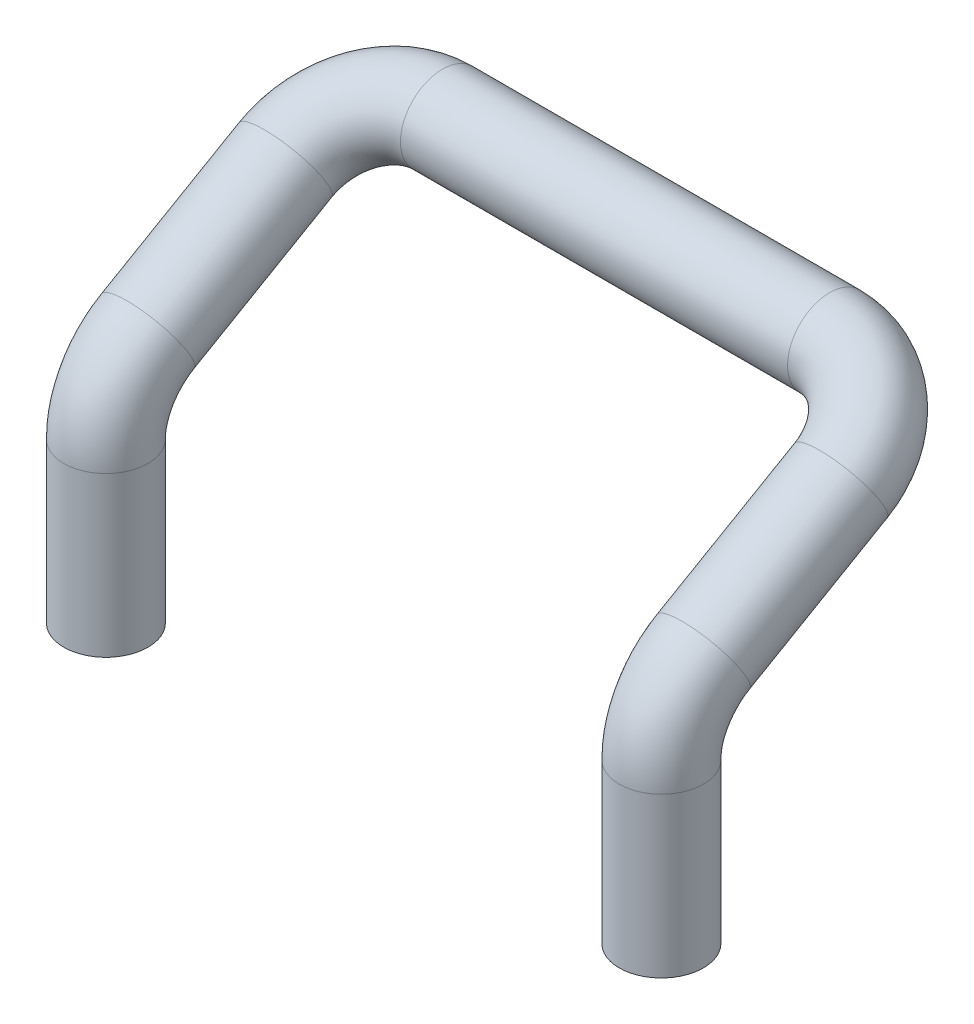
ISO-10303-21;
HEADER;
FILE_DESCRIPTION(('STEP AP214'),'2;1');
FILE_NAME('part.step','',(''),(''),'','','');
FILE_SCHEMA(('AUTOMOTIVE_DESIGN { 1 0 10303 214 1 1 1 1 }'));
ENDSEC;
DATA;
#1=APPLICATION_CONTEXT('core data for automotive mechanical design processes');
#2=APPLICATION_PROTOCOL_DEFINITION('international standard','automotive_design',2000,#1);
#3=PRODUCT_CONTEXT('',#1,'mechanical');
#4=PRODUCT('Part','Part','',(#3));
#5=PRODUCT_RELATED_PRODUCT_CATEGORY('part','',(#4));
#6=PRODUCT_DEFINITION_FORMATION('','',#4);
#7=PRODUCT_DEFINITION_CONTEXT('part definition',#1,'design');
#8=PRODUCT_DEFINITION('design','',#6,#7);
#9=PRODUCT_DEFINITION_SHAPE('','',#8);
#10=(LENGTH_UNIT() NAMED_UNIT(*) SI_UNIT(.MILLI.,.METRE.));
#11=(NAMED_UNIT(*) PLANE_ANGLE_UNIT() SI_UNIT($,.RADIAN.));
#12=(NAMED_UNIT(*) SI_UNIT($,.STERADIAN.) SOLID_ANGLE_UNIT());
#13=UNCERTAINTY_MEASURE_WITH_UNIT(LENGTH_MEASURE(1.E-05),#10,'distance_accuracy_value','');
#14=(GEOMETRIC_REPRESENTATION_CONTEXT(3) GLOBAL_UNCERTAINTY_ASSIGNED_CONTEXT((#13)) GLOBAL_UNIT_ASSIGNED_CONTEXT((#10,
#11,#12)) REPRESENTATION_CONTEXT('',''));
#15=CARTESIAN_POINT('',(0.,0.,0.));
#16=DIRECTION('',(0.,0.,1.));
#17=DIRECTION('',(1.,0.,0.));
#18=AXIS2_PLACEMENT_3D('',#15,#16,#17);
#19=CARTESIAN_POINT('',(66.,18.91,0.));
#20=DIRECTION('',(0.,-1.,0.));
#21=DIRECTION('',(0.,0.,-1.));
#22=AXIS2_PLACEMENT_3D('',#19,#20,#21);
#23=CYLINDRICAL_SURFACE('',#22,5.);
#24=CARTESIAN_POINT('',(66.,18.91,0.));
#25=DIRECTION('',(0.,-1.,0.));
#26=DIRECTION('',(0.,0.,1.));
#27=AXIS2_PLACEMENT_3D('',#24,#25,#26);
#28=CIRCLE('',#27,5.);
#29=CARTESIAN_POINT('',(66.,18.91,5.00000000000001));
#30=VERTEX_POINT('',#29);
#31=EDGE_CURVE('E45',#30,#30,#28,.T.);
#32=ORIENTED_EDGE('',*,*,#31,.T.);
#33=EDGE_LOOP('',(#32));
#34=FACE_BOUND('',#33,.T.);
#35=CARTESIAN_POINT('',(66.,0.,0.));
#36=DIRECTION('',(0.,-1.,0.));
#37=DIRECTION('',(0.,0.,1.));
#38=AXIS2_PLACEMENT_3D('',#35,#36,#37);
#39=CIRCLE('',#38,5.);
#40=CARTESIAN_POINT('',(66.,0.,5.00000000000002));
#41=VERTEX_POINT('',#40);
#42=EDGE_CURVE('E11',#41,#41,#39,.T.);
#43=ORIENTED_EDGE('',*,*,#42,.F.);
#44=EDGE_LOOP('',(#43));
#45=FACE_BOUND('',#44,.T.);
#46=ADVANCED_FACE('F38',(#34,#45),#23,.T.);
#47=CARTESIAN_POINT('',(66.,18.91,-10.));
#48=DIRECTION('',(1.,0.,0.));
#49=DIRECTION('',(0.,1.,0.));
#50=AXIS2_PLACEMENT_3D('',#47,#48,#49);
#51=TOROIDAL_SURFACE('',#50,10.,5.);
#52=CARTESIAN_POINT('',(66.,27.5708556446138,-5.00104215829332));
#53=DIRECTION('',(0.,-0.499895784170668,0.866085564461383));
#54=DIRECTION('',(0.,0.866085564461383,0.499895784170668));
#55=AXIS2_PLACEMENT_3D('',#52,#53,#54);
#56=CIRCLE('',#55,5.);
#57=CARTESIAN_POINT('',(66.,31.9012834669208,-2.50156323743998));
#58=VERTEX_POINT('',#57);
#59=EDGE_CURVE('E93',#58,#58,#56,.T.);
#60=CARTESIAN_POINT('',(66.,18.91,-10.));
#61=DIRECTION('',(1.,0.,0.));
#62=DIRECTION('',(0.,1.,0.));
#63=AXIS2_PLACEMENT_3D('',#60,#61,#62);
#64=CIRCLE('',#63,15.);
#65=EDGE_CURVE('',#58,#30,#64,.T.);
#66=ORIENTED_EDGE('',*,*,#59,.T.);
#67=ORIENTED_EDGE('',*,*,#31,.F.);
#68=ORIENTED_EDGE('',*,*,#65,.T.);
#69=ORIENTED_EDGE('',*,*,#65,.F.);
#70=EDGE_LOOP('',(#66,#68,#67,#69));
#71=FACE_BOUND('',#70,.T.);
#72=ADVANCED_FACE('F100',(#71),#51,.T.);
#73=CARTESIAN_POINT('',(66.,37.0010421582933,-21.3391443553862));
#74=DIRECTION('',(0.,-0.499895784170667,0.866085564461384));
#75=DIRECTION('',(0.,-0.866085564461384,-0.499895784170667));
#76=AXIS2_PLACEMENT_3D('',#73,#74,#75);
#77=CYLINDRICAL_SURFACE('',#76,5.);
#78=CARTESIAN_POINT('',(66.,37.0010421582933,-21.3391443553862));
#79=DIRECTION('',(0.,-0.499895784170668,0.866085564461383));
#80=DIRECTION('',(0.,0.866085564461383,0.499895784170668));
#81=AXIS2_PLACEMENT_3D('',#78,#79,#80);
#82=CIRCLE('',#81,5.);
#83=CARTESIAN_POINT('',(71.,37.0010421582933,-21.3391443553862));
#84=VERTEX_POINT('',#83);
#85=EDGE_CURVE('E90',#84,#84,#82,.T.);
#86=ORIENTED_EDGE('',*,*,#85,.T.);
#87=EDGE_LOOP('',(#86));
#88=FACE_BOUND('',#87,.T.);
#89=ORIENTED_EDGE('',*,*,#59,.F.);
#90=EDGE_LOOP('',(#89));
#91=FACE_BOUND('',#90,.T.);
#92=ADVANCED_FACE('F102',(#88,#91),#77,.T.);
#93=CARTESIAN_POINT('',(56.,37.0010421582933,-21.3391443553862));
#94=DIRECTION('',(0.,-0.866085564461383,-0.499895784170668));
#95=DIRECTION('',(0.,0.499895784170668,-0.866085564461383));
#96=AXIS2_PLACEMENT_3D('',#93,#94,#95);
#97=TOROIDAL_SURFACE('',#96,10.,5.);
#98=CARTESIAN_POINT('',(56.,42.,-30.));
#99=DIRECTION('',(1.,0.,0.));
#100=DIRECTION('',(0.,0.866085564461383,0.499895784170668));
#101=AXIS2_PLACEMENT_3D('',#98,#99,#100);
#102=CIRCLE('',#101,5.);
#103=CARTESIAN_POINT('',(56.,44.4994789208533,-34.3304278223069));
#104=VERTEX_POINT('',#103);
#105=EDGE_CURVE('E87',#104,#104,#102,.T.);
#106=CARTESIAN_POINT('',(56.,37.0010421582933,-21.3391443553862));
#107=DIRECTION('',(0.,-0.866085564461383,-0.499895784170668));
#108=DIRECTION('',(0.,0.499895784170668,-0.866085564461383));
#109=AXIS2_PLACEMENT_3D('',#106,#107,#108);
#110=CIRCLE('',#109,15.);
#111=EDGE_CURVE('',#104,#84,#110,.T.);
#112=ORIENTED_EDGE('',*,*,#105,.T.);
#113=ORIENTED_EDGE('',*,*,#85,.F.);
#114=ORIENTED_EDGE('',*,*,#111,.T.);
#115=ORIENTED_EDGE('',*,*,#111,.F.);
#116=EDGE_LOOP('',(#112,#114,#113,#115));
#117=FACE_BOUND('',#116,.T.);
#118=ADVANCED_FACE('F108',(#117),#97,.T.);
#119=CARTESIAN_POINT('',(10.,42.,-30.));
#120=DIRECTION('',(1.,0.,0.));
#121=DIRECTION('',(0.,0.,-1.));
#122=AXIS2_PLACEMENT_3D('',#119,#120,#121);
#123=CYLINDRICAL_SURFACE('',#122,5.);
#124=CARTESIAN_POINT('',(10.,42.,-30.));
#125=DIRECTION('',(1.,0.,0.));
#126=DIRECTION('',(0.,0.866085564461383,0.499895784170668));
#127=AXIS2_PLACEMENT_3D('',#124,#125,#126);
#128=CIRCLE('',#127,5.);
#129=CARTESIAN_POINT('',(10.,44.4994789208533,-34.3304278223069));
#130=VERTEX_POINT('',#129);
#131=EDGE_CURVE('E84',#130,#130,#128,.T.);
#132=ORIENTED_EDGE('',*,*,#131,.T.);
#133=EDGE_LOOP('',(#132));
#134=FACE_BOUND('',#133,.T.);
#135=ORIENTED_EDGE('',*,*,#105,.F.);
#136=EDGE_LOOP('',(#135));
#137=FACE_BOUND('',#136,.T.);
#138=ADVANCED_FACE('F114',(#134,#137),#123,.T.);
#139=CARTESIAN_POINT('',(10.,37.0010421582933,-21.3391443553862));
#140=DIRECTION('',(0.,-0.866085564461384,-0.499895784170668));
#141=DIRECTION('',(0.,0.499895784170668,-0.866085564461384));
#142=AXIS2_PLACEMENT_3D('',#139,#140,#141);
#143=TOROIDAL_SURFACE('',#142,10.,5.);
#144=CARTESIAN_POINT('',(0.,37.0010421582933,-21.3391443553862));
#145=DIRECTION('',(0.,0.499895784170668,-0.866085564461384));
#146=DIRECTION('',(0.,0.866085564461384,0.499895784170668));
#147=AXIS2_PLACEMENT_3D('',#144,#145,#146);
#148=CIRCLE('',#147,5.);
#149=CARTESIAN_POINT('',(-5.,37.0010421582933,-21.3391443553862));
#150=VERTEX_POINT('',#149);
#151=EDGE_CURVE('E81',#150,#150,#148,.T.);
#152=CARTESIAN_POINT('',(10.,37.0010421582933,-21.3391443553862));
#153=DIRECTION('',(0.,-0.866085564461384,-0.499895784170668));
#154=DIRECTION('',(0.,0.499895784170668,-0.866085564461384));
#155=AXIS2_PLACEMENT_3D('',#152,#153,#154);
#156=CIRCLE('',#155,15.);
#157=EDGE_CURVE('',#150,#130,#156,.T.);
#158=ORIENTED_EDGE('',*,*,#151,.T.);
#159=ORIENTED_EDGE('',*,*,#131,.F.);
#160=ORIENTED_EDGE('',*,*,#157,.T.);
#161=ORIENTED_EDGE('',*,*,#157,.F.);
#162=EDGE_LOOP('',(#158,#160,#159,#161));
#163=FACE_BOUND('',#162,.T.);
#164=ADVANCED_FACE('F118',(#163),#143,.T.);
#165=CARTESIAN_POINT('',(0.,27.5708556446138,-5.00104215829333));
#166=DIRECTION('',(0.,0.499895784170668,-0.866085564461384));
#167=DIRECTION('',(0.,0.866085564461384,0.499895784170668));
#168=AXIS2_PLACEMENT_3D('',#165,#166,#167);
#169=CYLINDRICAL_SURFACE('',#168,5.);
#170=CARTESIAN_POINT('',(0.,27.5708556446138,-5.00104215829333));
#171=DIRECTION('',(0.,0.499895784170668,-0.866085564461384));
#172=DIRECTION('',(0.,0.866085564461384,0.499895784170668));
#173=AXIS2_PLACEMENT_3D('',#170,#171,#172);
#174=CIRCLE('',#173,5.);
#175=CARTESIAN_POINT('',(0.,31.9012834669208,-2.50156323743999));
#176=VERTEX_POINT('',#175);
#177=EDGE_CURVE('E76',#176,#176,#174,.T.);
#178=ORIENTED_EDGE('',*,*,#177,.T.);
#179=EDGE_LOOP('',(#178));
#180=FACE_BOUND('',#179,.T.);
#181=ORIENTED_EDGE('',*,*,#151,.F.);
#182=EDGE_LOOP('',(#181));
#183=FACE_BOUND('',#182,.T.);
#184=ADVANCED_FACE('F122',(#180,#183),#169,.T.);
#185=CARTESIAN_POINT('',(0.,18.91,-10.));
#186=DIRECTION('',(-1.,0.,0.));
#187=DIRECTION('',(0.,0.,1.));
#188=AXIS2_PLACEMENT_3D('',#185,#186,#187);
#189=TOROIDAL_SURFACE('',#188,10.,5.);
#190=CARTESIAN_POINT('',(0.,18.91,0.));
#191=DIRECTION('',(0.,1.,0.));
#192=DIRECTION('',(0.,0.,1.));
#193=AXIS2_PLACEMENT_3D('',#190,#191,#192);
#194=CIRCLE('',#193,5.);
#195=CARTESIAN_POINT('',(0.,18.91,5.));
#196=VERTEX_POINT('',#195);
#197=EDGE_CURVE('E73',#196,#196,#194,.T.);
#198=CARTESIAN_POINT('',(0.,18.91,-10.));
#199=DIRECTION('',(-1.,0.,0.));
#200=DIRECTION('',(0.,0.,1.));
#201=AXIS2_PLACEMENT_3D('',#198,#199,#200);
#202=CIRCLE('',#201,15.);
#203=EDGE_CURVE('',#196,#176,#202,.T.);
#204=ORIENTED_EDGE('',*,*,#197,.T.);
#205=ORIENTED_EDGE('',*,*,#177,.F.);
#206=ORIENTED_EDGE('',*,*,#203,.T.);
#207=ORIENTED_EDGE('',*,*,#203,.F.);
#208=EDGE_LOOP('',(#204,#206,#205,#207));
#209=FACE_BOUND('',#208,.T.);
#210=ADVANCED_FACE('F126',(#209),#189,.T.);
#211=CARTESIAN_POINT('',(0.,18.91,0.));
#212=DIRECTION('',(0.,-1.,0.));
#213=DIRECTION('',(0.,0.,-1.));
#214=AXIS2_PLACEMENT_3D('',#211,#212,#213);
#215=CYLINDRICAL_SURFACE('',#214,5.);
#216=ORIENTED_EDGE('',*,*,#197,.F.);
#217=EDGE_LOOP('',(#216));
#218=FACE_BOUND('',#217,.T.);
#219=CARTESIAN_POINT('',(0.,0.,0.));
#220=DIRECTION('',(0.,1.,0.));
#221=DIRECTION('',(0.,0.,1.));
#222=AXIS2_PLACEMENT_3D('',#219,#220,#221);
#223=CIRCLE('',#222,5.);
#224=CARTESIAN_POINT('',(0.,0.,5.));
#225=VERTEX_POINT('',#224);
#226=EDGE_CURVE('E72',#225,#225,#223,.T.);
#227=ORIENTED_EDGE('',*,*,#226,.T.);
#228=EDGE_LOOP('',(#227));
#229=FACE_BOUND('',#228,.T.);
#230=ADVANCED_FACE('F130',(#218,#229),#215,.T.);
#231=CARTESIAN_POINT('',(66.,0.,0.));
#232=DIRECTION('',(0.,-1.,0.));
#233=DIRECTION('',(0.,0.,1.));
#234=AXIS2_PLACEMENT_3D('',#231,#232,#233);
#235=PLANE('',#234);
#236=CARTESIAN_POINT('',(66.,0.,0.));
#237=DIRECTION('',(0.,-1.,0.));
#238=DIRECTION('',(0.,0.,-1.));
#239=AXIS2_PLACEMENT_3D('',#236,#237,#238);
#240=CIRCLE('',#239,2.067);
#241=CARTESIAN_POINT('',(66.,0.,-2.067));
#242=VERTEX_POINT('',#241);
#243=EDGE_CURVE('E61',#242,#242,#240,.T.);
#244=ORIENTED_EDGE('',*,*,#243,.F.);
#245=EDGE_LOOP('',(#244));
#246=FACE_BOUND('',#245,.T.);
#247=ORIENTED_EDGE('',*,*,#42,.T.);
#248=EDGE_LOOP('',(#247));
#249=FACE_BOUND('',#248,.T.);
#250=ADVANCED_FACE('F134',(#246,#249),#235,.T.);
#251=CARTESIAN_POINT('',(0.,0.,0.));
#252=DIRECTION('',(0.,1.,0.));
#253=DIRECTION('',(0.,0.,1.));
#254=AXIS2_PLACEMENT_3D('',#251,#252,#253);
#255=PLANE('',#254);
#256=CARTESIAN_POINT('',(0.,0.,0.));
#257=DIRECTION('',(0.,-1.,0.));
#258=DIRECTION('',(0.,0.,-1.));
#259=AXIS2_PLACEMENT_3D('',#256,#257,#258);
#260=CIRCLE('',#259,2.067);
#261=CARTESIAN_POINT('',(0.,0.,-2.067));
#262=VERTEX_POINT('',#261);
#263=EDGE_CURVE('E62',#262,#262,#260,.T.);
#264=ORIENTED_EDGE('',*,*,#263,.F.);
#265=EDGE_LOOP('',(#264));
#266=FACE_BOUND('',#265,.T.);
#267=ORIENTED_EDGE('',*,*,#226,.F.);
#268=EDGE_LOOP('',(#267));
#269=FACE_BOUND('',#268,.T.);
#270=ADVANCED_FACE('F136',(#266,#269),#255,.F.);
#271=CARTESIAN_POINT('',(66.,15.,0.));
#272=DIRECTION('',(0.,-1.,0.));
#273=DIRECTION('',(0.,0.,-1.));
#274=AXIS2_PLACEMENT_3D('',#271,#272,#273);
#275=CONICAL_SURFACE('',#274,2.067,1.02974425867665);
#276=CARTESIAN_POINT('',(66.,16.24197889953,0.));
#277=VERTEX_POINT('',#276);
#278=VERTEX_LOOP('',#277);
#279=FACE_BOUND('',#278,.T.);
#280=CARTESIAN_POINT('',(66.,15.,0.));
#281=DIRECTION('',(0.,-1.,0.));
#282=DIRECTION('',(0.,0.,-1.));
#283=AXIS2_PLACEMENT_3D('',#280,#281,#282);
#284=CIRCLE('',#283,2.067);
#285=CARTESIAN_POINT('',(66.,15.,-2.067));
#286=VERTEX_POINT('',#285);
#287=EDGE_CURVE('E65',#286,#286,#284,.T.);
#288=ORIENTED_EDGE('',*,*,#287,.T.);
#289=EDGE_LOOP('',(#288));
#290=FACE_BOUND('',#289,.T.);
#291=ADVANCED_FACE('F139',(#279,#290),#275,.F.);
#292=CARTESIAN_POINT('',(66.,0.,0.));
#293=DIRECTION('',(0.,-1.,0.));
#294=DIRECTION('',(0.,0.,-1.));
#295=AXIS2_PLACEMENT_3D('',#292,#293,#294);
#296=CYLINDRICAL_SURFACE('',#295,2.067);
#297=ORIENTED_EDGE('',*,*,#287,.F.);
#298=EDGE_LOOP('',(#297));
#299=FACE_BOUND('',#298,.T.);
#300=ORIENTED_EDGE('',*,*,#243,.T.);
#301=EDGE_LOOP('',(#300));
#302=FACE_BOUND('',#301,.T.);
#303=ADVANCED_FACE('F55',(#299,#302),#296,.F.);
#304=CARTESIAN_POINT('',(0.,15.,0.));
#305=DIRECTION('',(0.,-1.,0.));
#306=DIRECTION('',(0.,0.,-1.));
#307=AXIS2_PLACEMENT_3D('',#304,#305,#306);
#308=CONICAL_SURFACE('',#307,2.067,1.02974425867665);
#309=CARTESIAN_POINT('',(0.,16.24197889953,0.));
#310=VERTEX_POINT('',#309);
#311=VERTEX_LOOP('',#310);
#312=FACE_BOUND('',#311,.T.);
#313=CARTESIAN_POINT('',(0.,15.,0.));
#314=DIRECTION('',(0.,-1.,0.));
#315=DIRECTION('',(0.,0.,-1.));
#316=AXIS2_PLACEMENT_3D('',#313,#314,#315);
#317=CIRCLE('',#316,2.067);
#318=CARTESIAN_POINT('',(0.,15.,-2.067));
#319=VERTEX_POINT('',#318);
#320=EDGE_CURVE('E59',#319,#319,#317,.T.);
#321=ORIENTED_EDGE('',*,*,#320,.T.);
#322=EDGE_LOOP('',(#321));
#323=FACE_BOUND('',#322,.T.);
#324=ADVANCED_FACE('F51',(#312,#323),#308,.F.);
#325=CARTESIAN_POINT('',(0.,0.,0.));
#326=DIRECTION('',(0.,-1.,0.));
#327=DIRECTION('',(0.,0.,-1.));
#328=AXIS2_PLACEMENT_3D('',#325,#326,#327);
#329=CYLINDRICAL_SURFACE('',#328,2.067);
#330=ORIENTED_EDGE('',*,*,#320,.F.);
#331=EDGE_LOOP('',(#330));
#332=FACE_BOUND('',#331,.T.);
#333=ORIENTED_EDGE('',*,*,#263,.T.);
#334=EDGE_LOOP('',(#333));
#335=FACE_BOUND('',#334,.T.);
#336=ADVANCED_FACE('F54',(#332,#335),#329,.F.);
#337=CLOSED_SHELL('',(#46,#72,#92,#118,#138,#164,#184,#210,#230,#250,#270,#291,#303,#324,#336));
#338=MANIFOLD_SOLID_BREP('B2',#337);
#339=ADVANCED_BREP_SHAPE_REPRESENTATION('',(#18,#338),#14);
#340=SHAPE_DEFINITION_REPRESENTATION(#9,#339);
ENDSEC;
END-ISO-10303-21;
